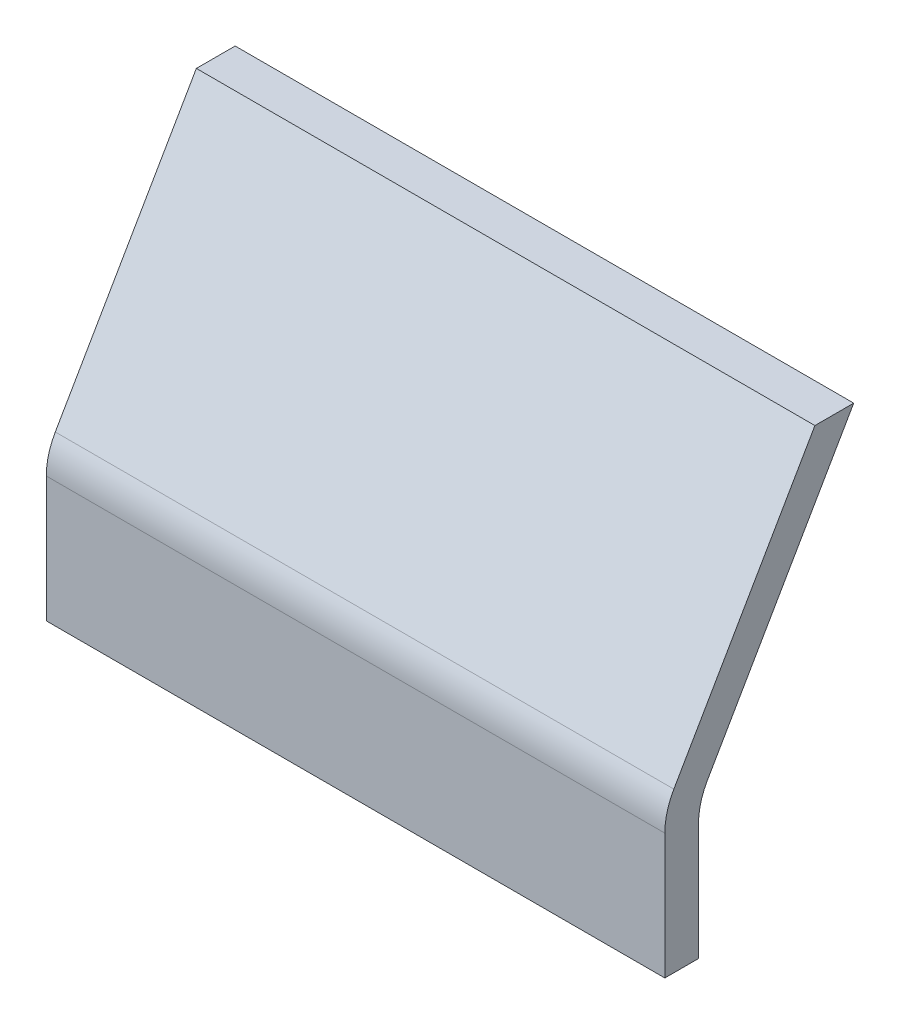
ISO-10303-21;
HEADER;
FILE_DESCRIPTION(('STEP AP214'),'2;1');
FILE_NAME('part.step','',(''),(''),'','','');
FILE_SCHEMA(('AUTOMOTIVE_DESIGN { 1 0 10303 214 1 1 1 1 }'));
ENDSEC;
DATA;
#1=APPLICATION_CONTEXT('core data for automotive mechanical design processes');
#2=APPLICATION_PROTOCOL_DEFINITION('international standard','automotive_design',2000,#1);
#3=PRODUCT_CONTEXT('',#1,'mechanical');
#4=PRODUCT('Part','Part','',(#3));
#5=PRODUCT_RELATED_PRODUCT_CATEGORY('part','',(#4));
#6=PRODUCT_DEFINITION_FORMATION('','',#4);
#7=PRODUCT_DEFINITION_CONTEXT('part definition',#1,'design');
#8=PRODUCT_DEFINITION('design','',#6,#7);
#9=PRODUCT_DEFINITION_SHAPE('','',#8);
#10=(LENGTH_UNIT() NAMED_UNIT(*) SI_UNIT(.MILLI.,.METRE.));
#11=(NAMED_UNIT(*) PLANE_ANGLE_UNIT() SI_UNIT($,.RADIAN.));
#12=(NAMED_UNIT(*) SI_UNIT($,.STERADIAN.) SOLID_ANGLE_UNIT());
#13=UNCERTAINTY_MEASURE_WITH_UNIT(LENGTH_MEASURE(1.E-05),#10,'distance_accuracy_value','');
#14=(GEOMETRIC_REPRESENTATION_CONTEXT(3) GLOBAL_UNCERTAINTY_ASSIGNED_CONTEXT((#13)) GLOBAL_UNIT_ASSIGNED_CONTEXT((#10,
#11,#12)) REPRESENTATION_CONTEXT('',''));
#15=CARTESIAN_POINT('',(0.,0.,0.));
#16=DIRECTION('',(0.,0.,1.));
#17=DIRECTION('',(1.,0.,0.));
#18=AXIS2_PLACEMENT_3D('',#15,#16,#17);
#19=CARTESIAN_POINT('',(92.,0.,-5.));
#20=DIRECTION('',(0.,1.,0.));
#21=DIRECTION('',(0.,0.,1.));
#22=AXIS2_PLACEMENT_3D('',#19,#20,#21);
#23=PLANE('',#22);
#24=DIRECTION('',(0.,0.,-1.));
#25=VECTOR('',#24,1.);
#26=CARTESIAN_POINT('',(0.,0.,-5.));
#27=LINE('',#26,#25);
#28=CARTESIAN_POINT('',(0.,0.,0.));
#29=VERTEX_POINT('',#28);
#30=CARTESIAN_POINT('',(0.,0.,-5.));
#31=VERTEX_POINT('',#30);
#32=EDGE_CURVE('E116',#29,#31,#27,.T.);
#33=ORIENTED_EDGE('',*,*,#32,.T.);
#34=DIRECTION('',(-1.,0.,0.));
#35=VECTOR('',#34,1.);
#36=CARTESIAN_POINT('',(92.,0.,-5.));
#37=LINE('',#36,#35);
#38=CARTESIAN_POINT('',(92.,0.,-5.));
#39=VERTEX_POINT('',#38);
#40=EDGE_CURVE('E98',#39,#31,#37,.T.);
#41=ORIENTED_EDGE('',*,*,#40,.F.);
#42=DIRECTION('',(0.,0.,-1.));
#43=VECTOR('',#42,1.);
#44=CARTESIAN_POINT('',(92.,0.,-5.));
#45=LINE('',#44,#43);
#46=CARTESIAN_POINT('',(92.,0.,0.));
#47=VERTEX_POINT('',#46);
#48=EDGE_CURVE('E103',#47,#39,#45,.T.);
#49=ORIENTED_EDGE('',*,*,#48,.F.);
#50=DIRECTION('',(-1.,0.,0.));
#51=VECTOR('',#50,1.);
#52=CARTESIAN_POINT('',(92.,0.,0.));
#53=LINE('',#52,#51);
#54=EDGE_CURVE('E158',#47,#29,#53,.T.);
#55=ORIENTED_EDGE('',*,*,#54,.T.);
#56=EDGE_LOOP('',(#33,#41,#49,#55));
#57=FACE_BOUND('',#56,.T.);
#58=ADVANCED_FACE('F33',(#57),#23,.F.);
#59=CARTESIAN_POINT('',(92.,20.,-5.));
#60=DIRECTION('',(0.,0.,1.));
#61=DIRECTION('',(0.,-1.,0.));
#62=AXIS2_PLACEMENT_3D('',#59,#60,#61);
#63=PLANE('',#62);
#64=DIRECTION('',(0.,1.,0.));
#65=VECTOR('',#64,1.);
#66=CARTESIAN_POINT('',(0.,20.,-5.));
#67=LINE('',#66,#65);
#68=CARTESIAN_POINT('',(0.,17.3205080756888,-5.));
#69=VERTEX_POINT('',#68);
#70=EDGE_CURVE('E148',#31,#69,#67,.T.);
#71=ORIENTED_EDGE('',*,*,#70,.T.);
#72=DIRECTION('',(-1.,0.,0.));
#73=VECTOR('',#72,1.);
#74=CARTESIAN_POINT('',(92.,17.3205080756888,-5.));
#75=LINE('',#74,#73);
#76=CARTESIAN_POINT('',(92.,17.3205080756888,-5.));
#77=VERTEX_POINT('',#76);
#78=EDGE_CURVE('E48',#69,#77,#75,.F.);
#79=ORIENTED_EDGE('',*,*,#78,.T.);
#80=DIRECTION('',(0.,1.,0.));
#81=VECTOR('',#80,1.);
#82=CARTESIAN_POINT('',(92.,20.,-5.));
#83=LINE('',#82,#81);
#84=EDGE_CURVE('E94',#39,#77,#83,.T.);
#85=ORIENTED_EDGE('',*,*,#84,.F.);
#86=ORIENTED_EDGE('',*,*,#40,.T.);
#87=EDGE_LOOP('',(#71,#79,#85,#86));
#88=FACE_BOUND('',#87,.T.);
#89=ADVANCED_FACE('F96',(#88),#63,.F.);
#90=CARTESIAN_POINT('',(92.,60.,-28.0940107675851));
#91=DIRECTION('',(0.,0.500000000000001,0.866025403784438));
#92=DIRECTION('',(0.,-0.866025403784438,0.500000000000001));
#93=AXIS2_PLACEMENT_3D('',#90,#91,#92);
#94=PLANE('',#93);
#95=DIRECTION('',(0.,0.866025403784438,-0.500000000000001));
#96=VECTOR('',#95,1.);
#97=CARTESIAN_POINT('',(92.,60.,-28.0940107675851));
#98=LINE('',#97,#96);
#99=CARTESIAN_POINT('',(92.,22.3205080756888,-6.33974596215561));
#100=VERTEX_POINT('',#99);
#101=CARTESIAN_POINT('',(92.,60.,-28.0940107675851));
#102=VERTEX_POINT('',#101);
#103=EDGE_CURVE('E102',#100,#102,#98,.T.);
#104=ORIENTED_EDGE('',*,*,#103,.F.);
#105=DIRECTION('',(-1.,0.,0.));
#106=VECTOR('',#105,1.);
#107=CARTESIAN_POINT('',(0.,22.3205080756888,-6.33974596215562));
#108=LINE('',#107,#106);
#109=CARTESIAN_POINT('',(0.,22.3205080756888,-6.33974596215561));
#110=VERTEX_POINT('',#109);
#111=EDGE_CURVE('E133',#100,#110,#108,.T.);
#112=ORIENTED_EDGE('',*,*,#111,.T.);
#113=DIRECTION('',(0.,0.866025403784438,-0.500000000000001));
#114=VECTOR('',#113,1.);
#115=CARTESIAN_POINT('',(0.,60.,-28.0940107675851));
#116=LINE('',#115,#114);
#117=CARTESIAN_POINT('',(0.,60.,-28.0940107675851));
#118=VERTEX_POINT('',#117);
#119=EDGE_CURVE('E141',#110,#118,#116,.T.);
#120=ORIENTED_EDGE('',*,*,#119,.T.);
#121=DIRECTION('',(-1.,0.,0.));
#122=VECTOR('',#121,1.);
#123=CARTESIAN_POINT('',(92.,60.,-28.0940107675851));
#124=LINE('',#123,#122);
#125=EDGE_CURVE('E118',#102,#118,#124,.T.);
#126=ORIENTED_EDGE('',*,*,#125,.F.);
#127=EDGE_LOOP('',(#104,#112,#120,#126));
#128=FACE_BOUND('',#127,.T.);
#129=ADVANCED_FACE('F139',(#128),#94,.F.);
#130=CARTESIAN_POINT('',(92.,60.,-22.3205080756888));
#131=DIRECTION('',(0.,-1.,0.));
#132=DIRECTION('',(0.,0.,-1.));
#133=AXIS2_PLACEMENT_3D('',#130,#131,#132);
#134=PLANE('',#133);
#135=DIRECTION('',(0.,0.,1.));
#136=VECTOR('',#135,1.);
#137=CARTESIAN_POINT('',(0.,60.,-22.3205080756888));
#138=LINE('',#137,#136);
#139=CARTESIAN_POINT('',(0.,60.,-22.3205080756888));
#140=VERTEX_POINT('',#139);
#141=EDGE_CURVE('E147',#118,#140,#138,.T.);
#142=ORIENTED_EDGE('',*,*,#141,.T.);
#143=DIRECTION('',(-1.,0.,0.));
#144=VECTOR('',#143,1.);
#145=CARTESIAN_POINT('',(92.,60.,-22.3205080756888));
#146=LINE('',#145,#144);
#147=CARTESIAN_POINT('',(92.,60.,-22.3205080756888));
#148=VERTEX_POINT('',#147);
#149=EDGE_CURVE('E124',#148,#140,#146,.T.);
#150=ORIENTED_EDGE('',*,*,#149,.F.);
#151=DIRECTION('',(0.,0.,1.));
#152=VECTOR('',#151,1.);
#153=CARTESIAN_POINT('',(92.,60.,-22.3205080756888));
#154=LINE('',#153,#152);
#155=EDGE_CURVE('E175',#102,#148,#154,.T.);
#156=ORIENTED_EDGE('',*,*,#155,.F.);
#157=ORIENTED_EDGE('',*,*,#125,.T.);
#158=EDGE_LOOP('',(#142,#150,#156,#157));
#159=FACE_BOUND('',#158,.T.);
#160=ADVANCED_FACE('F179',(#159),#134,.F.);
#161=CARTESIAN_POINT('',(92.,21.3397459621556,0.));
#162=DIRECTION('',(0.,-0.500000000000001,-0.866025403784438));
#163=DIRECTION('',(0.,0.866025403784438,-0.500000000000001));
#164=AXIS2_PLACEMENT_3D('',#161,#162,#163);
#165=PLANE('',#164);
#166=DIRECTION('',(0.,-0.866025403784438,0.500000000000001));
#167=VECTOR('',#166,1.);
#168=CARTESIAN_POINT('',(0.,21.3397459621556,0.));
#169=LINE('',#168,#167);
#170=CARTESIAN_POINT('',(0.,23.6602540378444,-1.33974596215562));
#171=VERTEX_POINT('',#170);
#172=EDGE_CURVE('E150',#140,#171,#169,.T.);
#173=ORIENTED_EDGE('',*,*,#172,.T.);
#174=DIRECTION('',(-1.,0.,0.));
#175=VECTOR('',#174,1.);
#176=CARTESIAN_POINT('',(92.,23.6602540378444,-1.33974596215562));
#177=LINE('',#176,#175);
#178=CARTESIAN_POINT('',(92.,23.6602540378444,-1.33974596215562));
#179=VERTEX_POINT('',#178);
#180=EDGE_CURVE('E129',#171,#179,#177,.F.);
#181=ORIENTED_EDGE('',*,*,#180,.T.);
#182=DIRECTION('',(0.,-0.866025403784438,0.500000000000001));
#183=VECTOR('',#182,1.);
#184=CARTESIAN_POINT('',(92.,21.3397459621556,0.));
#185=LINE('',#184,#183);
#186=EDGE_CURVE('E165',#148,#179,#185,.T.);
#187=ORIENTED_EDGE('',*,*,#186,.F.);
#188=ORIENTED_EDGE('',*,*,#149,.T.);
#189=EDGE_LOOP('',(#173,#181,#187,#188));
#190=FACE_BOUND('',#189,.T.);
#191=ADVANCED_FACE('F163',(#190),#165,.F.);
#192=CARTESIAN_POINT('',(92.,0.,0.));
#193=DIRECTION('',(0.,0.,-1.));
#194=DIRECTION('',(0.,1.,0.));
#195=AXIS2_PLACEMENT_3D('',#192,#193,#194);
#196=PLANE('',#195);
#197=DIRECTION('',(0.,-1.,0.));
#198=VECTOR('',#197,1.);
#199=CARTESIAN_POINT('',(92.,0.,0.));
#200=LINE('',#199,#198);
#201=CARTESIAN_POINT('',(92.,18.6602540378444,0.));
#202=VERTEX_POINT('',#201);
#203=EDGE_CURVE('E109',#202,#47,#200,.T.);
#204=ORIENTED_EDGE('',*,*,#203,.F.);
#205=DIRECTION('',(-1.,0.,0.));
#206=VECTOR('',#205,1.);
#207=CARTESIAN_POINT('',(92.,18.6602540378444,0.));
#208=LINE('',#207,#206);
#209=CARTESIAN_POINT('',(0.,18.6602540378444,0.));
#210=VERTEX_POINT('',#209);
#211=EDGE_CURVE('E117',#202,#210,#208,.T.);
#212=ORIENTED_EDGE('',*,*,#211,.T.);
#213=DIRECTION('',(0.,-1.,0.));
#214=VECTOR('',#213,1.);
#215=CARTESIAN_POINT('',(0.,0.,0.));
#216=LINE('',#215,#214);
#217=EDGE_CURVE('E113',#210,#29,#216,.T.);
#218=ORIENTED_EDGE('',*,*,#217,.T.);
#219=ORIENTED_EDGE('',*,*,#54,.F.);
#220=EDGE_LOOP('',(#204,#212,#218,#219));
#221=FACE_BOUND('',#220,.T.);
#222=ADVANCED_FACE('F173',(#221),#196,.F.);
#223=CARTESIAN_POINT('',(92.,0.,0.));
#224=DIRECTION('',(-1.,0.,0.));
#225=DIRECTION('',(0.,0.,1.));
#226=AXIS2_PLACEMENT_3D('',#223,#224,#225);
#227=PLANE('',#226);
#228=ORIENTED_EDGE('',*,*,#186,.T.);
#229=CARTESIAN_POINT('',(92.,18.6602540378444,-10.));
#230=DIRECTION('',(-1.,0.,0.));
#231=DIRECTION('',(0.,0.,1.));
#232=AXIS2_PLACEMENT_3D('',#229,#230,#231);
#233=CIRCLE('',#232,10.);
#234=EDGE_CURVE('E131',#179,#202,#233,.F.);
#235=ORIENTED_EDGE('',*,*,#234,.T.);
#236=ORIENTED_EDGE('',*,*,#203,.T.);
#237=ORIENTED_EDGE('',*,*,#48,.T.);
#238=ORIENTED_EDGE('',*,*,#84,.T.);
#239=CARTESIAN_POINT('',(92.,17.3205080756888,-15.));
#240=DIRECTION('',(-1.,0.,0.));
#241=DIRECTION('',(0.,0.,1.));
#242=AXIS2_PLACEMENT_3D('',#239,#240,#241);
#243=CIRCLE('',#242,10.);
#244=EDGE_CURVE('E11',#77,#100,#243,.T.);
#245=ORIENTED_EDGE('',*,*,#244,.T.);
#246=ORIENTED_EDGE('',*,*,#103,.T.);
#247=ORIENTED_EDGE('',*,*,#155,.T.);
#248=EDGE_LOOP('',(#228,#235,#236,#237,#238,#245,#246,#247));
#249=FACE_BOUND('',#248,.T.);
#250=ADVANCED_FACE('F107',(#249),#227,.F.);
#251=CARTESIAN_POINT('',(0.,0.,0.));
#252=DIRECTION('',(-1.,0.,0.));
#253=DIRECTION('',(0.,0.,1.));
#254=AXIS2_PLACEMENT_3D('',#251,#252,#253);
#255=PLANE('',#254);
#256=ORIENTED_EDGE('',*,*,#217,.F.);
#257=CARTESIAN_POINT('',(0.,18.6602540378444,-10.));
#258=DIRECTION('',(-1.,0.,0.));
#259=DIRECTION('',(0.,0.,1.));
#260=AXIS2_PLACEMENT_3D('',#257,#258,#259);
#261=CIRCLE('',#260,10.);
#262=EDGE_CURVE('E121',#210,#171,#261,.T.);
#263=ORIENTED_EDGE('',*,*,#262,.T.);
#264=ORIENTED_EDGE('',*,*,#172,.F.);
#265=ORIENTED_EDGE('',*,*,#141,.F.);
#266=ORIENTED_EDGE('',*,*,#119,.F.);
#267=CARTESIAN_POINT('',(0.,17.3205080756888,-15.));
#268=DIRECTION('',(-1.,0.,0.));
#269=DIRECTION('',(0.,0.,1.));
#270=AXIS2_PLACEMENT_3D('',#267,#268,#269);
#271=CIRCLE('',#270,10.);
#272=EDGE_CURVE('E41',#110,#69,#271,.F.);
#273=ORIENTED_EDGE('',*,*,#272,.T.);
#274=ORIENTED_EDGE('',*,*,#70,.F.);
#275=ORIENTED_EDGE('',*,*,#32,.F.);
#276=EDGE_LOOP('',(#256,#263,#264,#265,#266,#273,#274,#275));
#277=FACE_BOUND('',#276,.T.);
#278=ADVANCED_FACE('F145',(#277),#255,.T.);
#279=CARTESIAN_POINT('',(92.,18.6602540378444,-10.));
#280=DIRECTION('',(-1.,0.,0.));
#281=DIRECTION('',(0.,0.,1.));
#282=AXIS2_PLACEMENT_3D('',#279,#280,#281);
#283=CYLINDRICAL_SURFACE('',#282,10.);
#284=ORIENTED_EDGE('',*,*,#234,.F.);
#285=ORIENTED_EDGE('',*,*,#180,.F.);
#286=ORIENTED_EDGE('',*,*,#262,.F.);
#287=ORIENTED_EDGE('',*,*,#211,.F.);
#288=EDGE_LOOP('',(#284,#285,#286,#287));
#289=FACE_BOUND('',#288,.T.);
#290=ADVANCED_FACE('F171',(#289),#283,.T.);
#291=CARTESIAN_POINT('',(92.,17.3205080756888,-15.));
#292=DIRECTION('',(1.,0.,0.));
#293=DIRECTION('',(0.,0.,-1.));
#294=AXIS2_PLACEMENT_3D('',#291,#292,#293);
#295=CYLINDRICAL_SURFACE('',#294,10.);
#296=ORIENTED_EDGE('',*,*,#244,.F.);
#297=ORIENTED_EDGE('',*,*,#78,.F.);
#298=ORIENTED_EDGE('',*,*,#272,.F.);
#299=ORIENTED_EDGE('',*,*,#111,.F.);
#300=EDGE_LOOP('',(#296,#297,#298,#299));
#301=FACE_BOUND('',#300,.T.);
#302=ADVANCED_FACE('F35',(#301),#295,.F.);
#303=CLOSED_SHELL('',(#58,#89,#129,#160,#191,#222,#250,#278,#290,#302));
#304=MANIFOLD_SOLID_BREP('B2',#303);
#305=ADVANCED_BREP_SHAPE_REPRESENTATION('',(#18,#304),#14);
#306=SHAPE_DEFINITION_REPRESENTATION(#9,#305);
ENDSEC;
END-ISO-10303-21;
